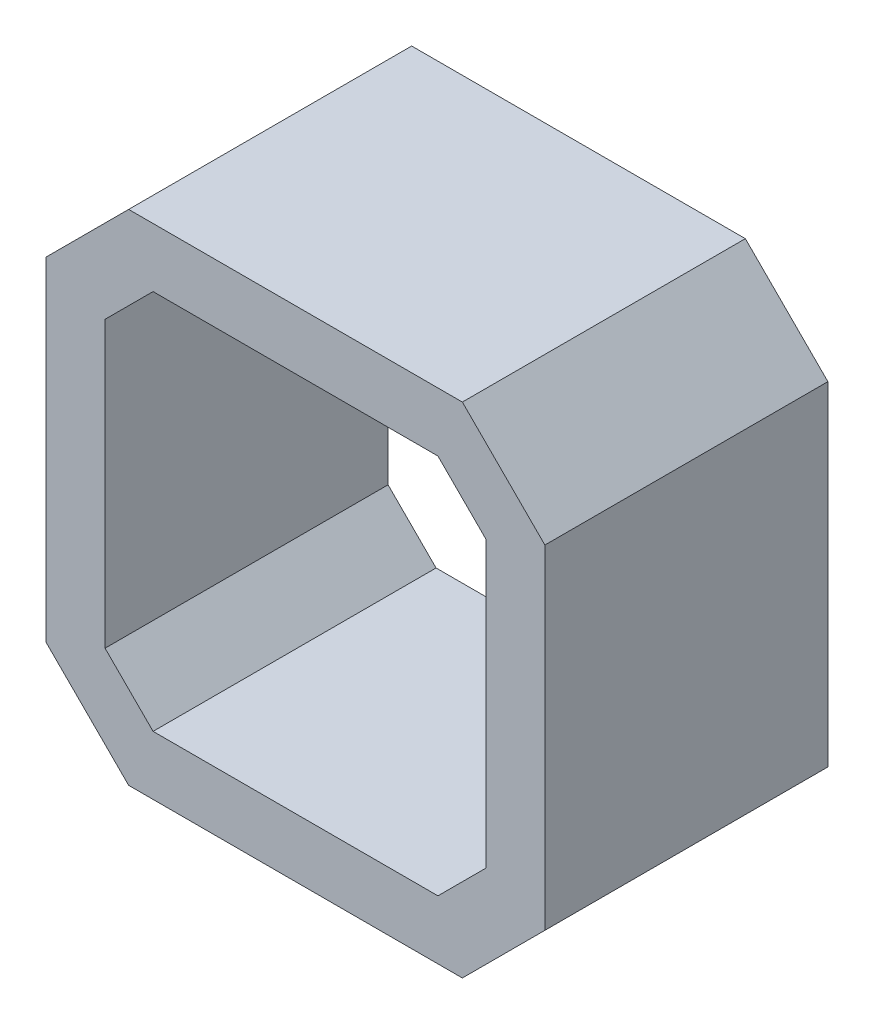
ISO-10303-21;
HEADER;
FILE_DESCRIPTION(('STEP AP214'),'2;1');
FILE_NAME('part.step','',(''),(''),'','','');
FILE_SCHEMA(('AUTOMOTIVE_DESIGN { 1 0 10303 214 1 1 1 1 }'));
ENDSEC;
DATA;
#1=APPLICATION_CONTEXT('core data for automotive mechanical design processes');
#2=APPLICATION_PROTOCOL_DEFINITION('international standard','automotive_design',2000,#1);
#3=PRODUCT_CONTEXT('',#1,'mechanical');
#4=PRODUCT('Part','Part','',(#3));
#5=PRODUCT_RELATED_PRODUCT_CATEGORY('part','',(#4));
#6=PRODUCT_DEFINITION_FORMATION('','',#4);
#7=PRODUCT_DEFINITION_CONTEXT('part definition',#1,'design');
#8=PRODUCT_DEFINITION('design','',#6,#7);
#9=PRODUCT_DEFINITION_SHAPE('','',#8);
#10=(LENGTH_UNIT() NAMED_UNIT(*) SI_UNIT(.MILLI.,.METRE.));
#11=(NAMED_UNIT(*) PLANE_ANGLE_UNIT() SI_UNIT($,.RADIAN.));
#12=(NAMED_UNIT(*) SI_UNIT($,.STERADIAN.) SOLID_ANGLE_UNIT());
#13=UNCERTAINTY_MEASURE_WITH_UNIT(LENGTH_MEASURE(1.E-05),#10,'distance_accuracy_value','');
#14=(GEOMETRIC_REPRESENTATION_CONTEXT(3) GLOBAL_UNCERTAINTY_ASSIGNED_CONTEXT((#13)) GLOBAL_UNIT_ASSIGNED_CONTEXT((#10,
#11,#12)) REPRESENTATION_CONTEXT('',''));
#15=CARTESIAN_POINT('',(0.,0.,0.));
#16=DIRECTION('',(0.,0.,1.));
#17=DIRECTION('',(1.,0.,0.));
#18=AXIS2_PLACEMENT_3D('',#15,#16,#17);
#19=CARTESIAN_POINT('',(0.,0.,24.));
#20=DIRECTION('',(0.,0.,-1.));
#21=DIRECTION('',(-1.,0.,0.));
#22=AXIS2_PLACEMENT_3D('',#19,#20,#21);
#23=PLANE('',#22);
#24=DIRECTION('',(-1.,0.,0.));
#25=VECTOR('',#24,1.);
#26=CARTESIAN_POINT('',(14.15,21.15,24.));
#27=LINE('',#26,#25);
#28=CARTESIAN_POINT('',(14.15,21.15,24.));
#29=VERTEX_POINT('',#28);
#30=CARTESIAN_POINT('',(-14.15,21.15,24.));
#31=VERTEX_POINT('',#30);
#32=EDGE_CURVE('E255',#29,#31,#27,.T.);
#33=ORIENTED_EDGE('',*,*,#32,.T.);
#34=DIRECTION('',(-0.707106781186547,-0.707106781186547,0.));
#35=VECTOR('',#34,1.);
#36=CARTESIAN_POINT('',(-14.15,21.15,24.));
#37=LINE('',#36,#35);
#38=CARTESIAN_POINT('',(-21.15,14.15,24.));
#39=VERTEX_POINT('',#38);
#40=EDGE_CURVE('E259',#31,#39,#37,.T.);
#41=ORIENTED_EDGE('',*,*,#40,.T.);
#42=DIRECTION('',(0.,-1.,0.));
#43=VECTOR('',#42,1.);
#44=CARTESIAN_POINT('',(-21.15,-14.15,24.));
#45=LINE('',#44,#43);
#46=CARTESIAN_POINT('',(-21.15,-14.15,24.));
#47=VERTEX_POINT('',#46);
#48=EDGE_CURVE('E263',#39,#47,#45,.T.);
#49=ORIENTED_EDGE('',*,*,#48,.T.);
#50=DIRECTION('',(0.707106781186547,-0.707106781186547,0.));
#51=VECTOR('',#50,1.);
#52=CARTESIAN_POINT('',(-14.15,-21.15,24.));
#53=LINE('',#52,#51);
#54=CARTESIAN_POINT('',(-14.15,-21.15,24.));
#55=VERTEX_POINT('',#54);
#56=EDGE_CURVE('E266',#47,#55,#53,.T.);
#57=ORIENTED_EDGE('',*,*,#56,.T.);
#58=DIRECTION('',(1.,0.,0.));
#59=VECTOR('',#58,1.);
#60=CARTESIAN_POINT('',(14.15,-21.15,24.));
#61=LINE('',#60,#59);
#62=CARTESIAN_POINT('',(14.15,-21.15,24.));
#63=VERTEX_POINT('',#62);
#64=EDGE_CURVE('E269',#55,#63,#61,.T.);
#65=ORIENTED_EDGE('',*,*,#64,.T.);
#66=DIRECTION('',(0.707106781186547,0.707106781186547,0.));
#67=VECTOR('',#66,1.);
#68=CARTESIAN_POINT('',(21.15,-14.15,24.));
#69=LINE('',#68,#67);
#70=CARTESIAN_POINT('',(21.15,-14.15,24.));
#71=VERTEX_POINT('',#70);
#72=EDGE_CURVE('E272',#63,#71,#69,.T.);
#73=ORIENTED_EDGE('',*,*,#72,.T.);
#74=DIRECTION('',(0.,1.,0.));
#75=VECTOR('',#74,1.);
#76=CARTESIAN_POINT('',(21.15,-14.15,24.));
#77=LINE('',#76,#75);
#78=CARTESIAN_POINT('',(21.15,14.15,24.));
#79=VERTEX_POINT('',#78);
#80=EDGE_CURVE('E275',#71,#79,#77,.T.);
#81=ORIENTED_EDGE('',*,*,#80,.T.);
#82=DIRECTION('',(-0.707106781186547,0.707106781186547,0.));
#83=VECTOR('',#82,1.);
#84=CARTESIAN_POINT('',(21.15,14.15,24.));
#85=LINE('',#84,#83);
#86=EDGE_CURVE('E278',#79,#29,#85,.T.);
#87=ORIENTED_EDGE('',*,*,#86,.T.);
#88=EDGE_LOOP('',(#33,#41,#49,#57,#65,#73,#81,#87));
#89=FACE_BOUND('',#88,.T.);
#90=DIRECTION('',(-0.707106781186547,0.707106781186547,0.));
#91=VECTOR('',#90,1.);
#92=CARTESIAN_POINT('',(16.15,12.0789321881345,24.));
#93=LINE('',#92,#91);
#94=CARTESIAN_POINT('',(16.15,12.0789321881345,24.));
#95=VERTEX_POINT('',#94);
#96=CARTESIAN_POINT('',(12.0789321881345,16.15,24.));
#97=VERTEX_POINT('',#96);
#98=EDGE_CURVE('E164',#95,#97,#93,.T.);
#99=ORIENTED_EDGE('',*,*,#98,.F.);
#100=DIRECTION('',(0.,1.,0.));
#101=VECTOR('',#100,1.);
#102=CARTESIAN_POINT('',(16.15,-12.0789321881345,24.));
#103=LINE('',#102,#101);
#104=CARTESIAN_POINT('',(16.15,-12.0789321881345,24.));
#105=VERTEX_POINT('',#104);
#106=EDGE_CURVE('E208',#105,#95,#103,.T.);
#107=ORIENTED_EDGE('',*,*,#106,.F.);
#108=DIRECTION('',(0.707106781186547,0.707106781186547,0.));
#109=VECTOR('',#108,1.);
#110=CARTESIAN_POINT('',(16.15,-12.0789321881345,24.));
#111=LINE('',#110,#109);
#112=CARTESIAN_POINT('',(12.0789321881345,-16.15,24.));
#113=VERTEX_POINT('',#112);
#114=EDGE_CURVE('E205',#113,#105,#111,.T.);
#115=ORIENTED_EDGE('',*,*,#114,.F.);
#116=DIRECTION('',(1.,0.,0.));
#117=VECTOR('',#116,1.);
#118=CARTESIAN_POINT('',(12.0789321881345,-16.15,24.));
#119=LINE('',#118,#117);
#120=CARTESIAN_POINT('',(-12.0789321881345,-16.15,24.));
#121=VERTEX_POINT('',#120);
#122=EDGE_CURVE('E202',#121,#113,#119,.T.);
#123=ORIENTED_EDGE('',*,*,#122,.F.);
#124=DIRECTION('',(0.707106781186547,-0.707106781186547,0.));
#125=VECTOR('',#124,1.);
#126=CARTESIAN_POINT('',(-12.0789321881345,-16.15,24.));
#127=LINE('',#126,#125);
#128=CARTESIAN_POINT('',(-16.15,-12.0789321881345,24.));
#129=VERTEX_POINT('',#128);
#130=EDGE_CURVE('E199',#129,#121,#127,.T.);
#131=ORIENTED_EDGE('',*,*,#130,.F.);
#132=DIRECTION('',(0.,-1.,0.));
#133=VECTOR('',#132,1.);
#134=CARTESIAN_POINT('',(-16.15,-12.0789321881345,24.));
#135=LINE('',#134,#133);
#136=CARTESIAN_POINT('',(-16.15,12.0789321881345,24.));
#137=VERTEX_POINT('',#136);
#138=EDGE_CURVE('E194',#137,#129,#135,.T.);
#139=ORIENTED_EDGE('',*,*,#138,.F.);
#140=DIRECTION('',(-0.707106781186548,-0.707106781186547,0.));
#141=VECTOR('',#140,1.);
#142=CARTESIAN_POINT('',(-12.0789321881345,16.15,24.));
#143=LINE('',#142,#141);
#144=CARTESIAN_POINT('',(-12.0789321881345,16.15,24.));
#145=VERTEX_POINT('',#144);
#146=EDGE_CURVE('E187',#145,#137,#143,.T.);
#147=ORIENTED_EDGE('',*,*,#146,.F.);
#148=DIRECTION('',(-1.,0.,0.));
#149=VECTOR('',#148,1.);
#150=CARTESIAN_POINT('',(12.0789321881345,16.15,24.));
#151=LINE('',#150,#149);
#152=EDGE_CURVE('E173',#97,#145,#151,.T.);
#153=ORIENTED_EDGE('',*,*,#152,.F.);
#154=EDGE_LOOP('',(#99,#107,#115,#123,#131,#139,#147,#153));
#155=FACE_BOUND('',#154,.T.);
#156=ADVANCED_FACE('F50',(#89,#155),#23,.F.);
#157=CARTESIAN_POINT('',(0.,0.,0.));
#158=DIRECTION('',(0.,0.,-1.));
#159=DIRECTION('',(-1.,0.,0.));
#160=AXIS2_PLACEMENT_3D('',#157,#158,#159);
#161=PLANE('',#160);
#162=DIRECTION('',(-1.,0.,0.));
#163=VECTOR('',#162,1.);
#164=CARTESIAN_POINT('',(14.15,21.15,0.));
#165=LINE('',#164,#163);
#166=CARTESIAN_POINT('',(14.15,21.15,0.));
#167=VERTEX_POINT('',#166);
#168=CARTESIAN_POINT('',(-14.15,21.15,0.));
#169=VERTEX_POINT('',#168);
#170=EDGE_CURVE('E182',#167,#169,#165,.T.);
#171=ORIENTED_EDGE('',*,*,#170,.F.);
#172=DIRECTION('',(-0.707106781186547,0.707106781186547,0.));
#173=VECTOR('',#172,1.);
#174=CARTESIAN_POINT('',(21.15,14.15,0.));
#175=LINE('',#174,#173);
#176=CARTESIAN_POINT('',(21.15,14.15,0.));
#177=VERTEX_POINT('',#176);
#178=EDGE_CURVE('E260',#177,#167,#175,.T.);
#179=ORIENTED_EDGE('',*,*,#178,.F.);
#180=DIRECTION('',(0.,1.,0.));
#181=VECTOR('',#180,1.);
#182=CARTESIAN_POINT('',(21.15,-14.15,0.));
#183=LINE('',#182,#181);
#184=CARTESIAN_POINT('',(21.15,-14.15,0.));
#185=VERTEX_POINT('',#184);
#186=EDGE_CURVE('E300',#185,#177,#183,.T.);
#187=ORIENTED_EDGE('',*,*,#186,.F.);
#188=DIRECTION('',(0.707106781186547,0.707106781186547,0.));
#189=VECTOR('',#188,1.);
#190=CARTESIAN_POINT('',(21.15,-14.15,0.));
#191=LINE('',#190,#189);
#192=CARTESIAN_POINT('',(14.15,-21.15,0.));
#193=VERTEX_POINT('',#192);
#194=EDGE_CURVE('E297',#193,#185,#191,.T.);
#195=ORIENTED_EDGE('',*,*,#194,.F.);
#196=DIRECTION('',(1.,0.,0.));
#197=VECTOR('',#196,1.);
#198=CARTESIAN_POINT('',(14.15,-21.15,0.));
#199=LINE('',#198,#197);
#200=CARTESIAN_POINT('',(-14.15,-21.15,0.));
#201=VERTEX_POINT('',#200);
#202=EDGE_CURVE('E294',#201,#193,#199,.T.);
#203=ORIENTED_EDGE('',*,*,#202,.F.);
#204=DIRECTION('',(0.707106781186547,-0.707106781186547,0.));
#205=VECTOR('',#204,1.);
#206=CARTESIAN_POINT('',(-14.15,-21.15,0.));
#207=LINE('',#206,#205);
#208=CARTESIAN_POINT('',(-21.15,-14.15,0.));
#209=VERTEX_POINT('',#208);
#210=EDGE_CURVE('E291',#209,#201,#207,.T.);
#211=ORIENTED_EDGE('',*,*,#210,.F.);
#212=DIRECTION('',(0.,-1.,0.));
#213=VECTOR('',#212,1.);
#214=CARTESIAN_POINT('',(-21.15,-14.15,0.));
#215=LINE('',#214,#213);
#216=CARTESIAN_POINT('',(-21.15,14.15,0.));
#217=VERTEX_POINT('',#216);
#218=EDGE_CURVE('E288',#217,#209,#215,.T.);
#219=ORIENTED_EDGE('',*,*,#218,.F.);
#220=DIRECTION('',(-0.707106781186547,-0.707106781186547,0.));
#221=VECTOR('',#220,1.);
#222=CARTESIAN_POINT('',(-14.15,21.15,0.));
#223=LINE('',#222,#221);
#224=EDGE_CURVE('E285',#169,#217,#223,.T.);
#225=ORIENTED_EDGE('',*,*,#224,.F.);
#226=EDGE_LOOP('',(#171,#179,#187,#195,#203,#211,#219,#225));
#227=FACE_BOUND('',#226,.T.);
#228=DIRECTION('',(0.,1.,0.));
#229=VECTOR('',#228,1.);
#230=CARTESIAN_POINT('',(16.15,-12.0789321881345,0.));
#231=LINE('',#230,#229);
#232=CARTESIAN_POINT('',(16.15,-12.0789321881345,0.));
#233=VERTEX_POINT('',#232);
#234=CARTESIAN_POINT('',(16.15,12.0789321881345,0.));
#235=VERTEX_POINT('',#234);
#236=EDGE_CURVE('E174',#233,#235,#231,.T.);
#237=ORIENTED_EDGE('',*,*,#236,.T.);
#238=DIRECTION('',(-0.707106781186547,0.707106781186547,0.));
#239=VECTOR('',#238,1.);
#240=CARTESIAN_POINT('',(16.15,12.0789321881345,0.));
#241=LINE('',#240,#239);
#242=CARTESIAN_POINT('',(12.0789321881345,16.15,0.));
#243=VERTEX_POINT('',#242);
#244=EDGE_CURVE('E74',#235,#243,#241,.T.);
#245=ORIENTED_EDGE('',*,*,#244,.T.);
#246=DIRECTION('',(-1.,0.,0.));
#247=VECTOR('',#246,1.);
#248=CARTESIAN_POINT('',(12.0789321881345,16.15,0.));
#249=LINE('',#248,#247);
#250=CARTESIAN_POINT('',(-12.0789321881345,16.15,0.));
#251=VERTEX_POINT('',#250);
#252=EDGE_CURVE('E180',#243,#251,#249,.T.);
#253=ORIENTED_EDGE('',*,*,#252,.T.);
#254=DIRECTION('',(-0.707106781186548,-0.707106781186547,0.));
#255=VECTOR('',#254,1.);
#256=CARTESIAN_POINT('',(-12.0789321881345,16.15,0.));
#257=LINE('',#256,#255);
#258=CARTESIAN_POINT('',(-16.15,12.0789321881345,0.));
#259=VERTEX_POINT('',#258);
#260=EDGE_CURVE('E215',#251,#259,#257,.T.);
#261=ORIENTED_EDGE('',*,*,#260,.T.);
#262=DIRECTION('',(0.,-1.,0.));
#263=VECTOR('',#262,1.);
#264=CARTESIAN_POINT('',(-16.15,-12.0789321881345,0.));
#265=LINE('',#264,#263);
#266=CARTESIAN_POINT('',(-16.15,-12.0789321881345,0.));
#267=VERTEX_POINT('',#266);
#268=EDGE_CURVE('E219',#259,#267,#265,.T.);
#269=ORIENTED_EDGE('',*,*,#268,.T.);
#270=DIRECTION('',(0.707106781186547,-0.707106781186547,0.));
#271=VECTOR('',#270,1.);
#272=CARTESIAN_POINT('',(-12.0789321881345,-16.15,0.));
#273=LINE('',#272,#271);
#274=CARTESIAN_POINT('',(-12.0789321881345,-16.15,0.));
#275=VERTEX_POINT('',#274);
#276=EDGE_CURVE('E223',#267,#275,#273,.T.);
#277=ORIENTED_EDGE('',*,*,#276,.T.);
#278=DIRECTION('',(1.,0.,0.));
#279=VECTOR('',#278,1.);
#280=CARTESIAN_POINT('',(12.0789321881345,-16.15,0.));
#281=LINE('',#280,#279);
#282=CARTESIAN_POINT('',(12.0789321881345,-16.15,0.));
#283=VERTEX_POINT('',#282);
#284=EDGE_CURVE('E227',#275,#283,#281,.T.);
#285=ORIENTED_EDGE('',*,*,#284,.T.);
#286=DIRECTION('',(0.707106781186547,0.707106781186547,0.));
#287=VECTOR('',#286,1.);
#288=CARTESIAN_POINT('',(16.15,-12.0789321881345,0.));
#289=LINE('',#288,#287);
#290=EDGE_CURVE('E231',#283,#233,#289,.T.);
#291=ORIENTED_EDGE('',*,*,#290,.T.);
#292=EDGE_LOOP('',(#237,#245,#253,#261,#269,#277,#285,#291));
#293=FACE_BOUND('',#292,.T.);
#294=ADVANCED_FACE('F339',(#227,#293),#161,.T.);
#295=CARTESIAN_POINT('',(14.15,21.15,24.));
#296=DIRECTION('',(0.,-1.,0.));
#297=DIRECTION('',(1.,0.,0.));
#298=AXIS2_PLACEMENT_3D('',#295,#296,#297);
#299=PLANE('',#298);
#300=ORIENTED_EDGE('',*,*,#170,.T.);
#301=DIRECTION('',(0.,0.,-1.));
#302=VECTOR('',#301,1.);
#303=CARTESIAN_POINT('',(-14.15,21.15,24.));
#304=LINE('',#303,#302);
#305=EDGE_CURVE('E11',#31,#169,#304,.T.);
#306=ORIENTED_EDGE('',*,*,#305,.F.);
#307=ORIENTED_EDGE('',*,*,#32,.F.);
#308=DIRECTION('',(0.,0.,-1.));
#309=VECTOR('',#308,1.);
#310=CARTESIAN_POINT('',(14.15,21.15,24.));
#311=LINE('',#310,#309);
#312=EDGE_CURVE('E281',#29,#167,#311,.T.);
#313=ORIENTED_EDGE('',*,*,#312,.T.);
#314=EDGE_LOOP('',(#300,#306,#307,#313));
#315=FACE_BOUND('',#314,.T.);
#316=ADVANCED_FACE('F52',(#315),#299,.F.);
#317=CARTESIAN_POINT('',(-14.15,21.15,24.));
#318=DIRECTION('',(0.707106781186548,-0.707106781186548,0.));
#319=DIRECTION('',(0.707106781186548,0.707106781186548,0.));
#320=AXIS2_PLACEMENT_3D('',#317,#318,#319);
#321=PLANE('',#320);
#322=ORIENTED_EDGE('',*,*,#224,.T.);
#323=DIRECTION('',(0.,0.,-1.));
#324=VECTOR('',#323,1.);
#325=CARTESIAN_POINT('',(-21.15,14.15,24.));
#326=LINE('',#325,#324);
#327=EDGE_CURVE('E59',#39,#217,#326,.T.);
#328=ORIENTED_EDGE('',*,*,#327,.F.);
#329=ORIENTED_EDGE('',*,*,#40,.F.);
#330=ORIENTED_EDGE('',*,*,#305,.T.);
#331=EDGE_LOOP('',(#322,#328,#329,#330));
#332=FACE_BOUND('',#331,.T.);
#333=ADVANCED_FACE('F356',(#332),#321,.F.);
#334=CARTESIAN_POINT('',(-21.15,-14.15,24.));
#335=DIRECTION('',(1.,0.,0.));
#336=DIRECTION('',(0.,0.,-1.));
#337=AXIS2_PLACEMENT_3D('',#334,#335,#336);
#338=PLANE('',#337);
#339=ORIENTED_EDGE('',*,*,#218,.T.);
#340=DIRECTION('',(0.,0.,-1.));
#341=VECTOR('',#340,1.);
#342=CARTESIAN_POINT('',(-21.15,-14.15,24.));
#343=LINE('',#342,#341);
#344=EDGE_CURVE('E323',#47,#209,#343,.T.);
#345=ORIENTED_EDGE('',*,*,#344,.F.);
#346=ORIENTED_EDGE('',*,*,#48,.F.);
#347=ORIENTED_EDGE('',*,*,#327,.T.);
#348=EDGE_LOOP('',(#339,#345,#346,#347));
#349=FACE_BOUND('',#348,.T.);
#350=ADVANCED_FACE('F333',(#349),#338,.F.);
#351=CARTESIAN_POINT('',(-14.15,-21.15,24.));
#352=DIRECTION('',(0.707106781186548,0.707106781186548,0.));
#353=DIRECTION('',(-0.707106781186548,0.707106781186548,0.));
#354=AXIS2_PLACEMENT_3D('',#351,#352,#353);
#355=PLANE('',#354);
#356=ORIENTED_EDGE('',*,*,#210,.T.);
#357=DIRECTION('',(0.,0.,-1.));
#358=VECTOR('',#357,1.);
#359=CARTESIAN_POINT('',(-14.15,-21.15,24.));
#360=LINE('',#359,#358);
#361=EDGE_CURVE('E319',#55,#201,#360,.T.);
#362=ORIENTED_EDGE('',*,*,#361,.F.);
#363=ORIENTED_EDGE('',*,*,#56,.F.);
#364=ORIENTED_EDGE('',*,*,#344,.T.);
#365=EDGE_LOOP('',(#356,#362,#363,#364));
#366=FACE_BOUND('',#365,.T.);
#367=ADVANCED_FACE('F345',(#366),#355,.F.);
#368=CARTESIAN_POINT('',(14.15,-21.15,24.));
#369=DIRECTION('',(0.,1.,0.));
#370=DIRECTION('',(-1.,0.,0.));
#371=AXIS2_PLACEMENT_3D('',#368,#369,#370);
#372=PLANE('',#371);
#373=ORIENTED_EDGE('',*,*,#202,.T.);
#374=DIRECTION('',(0.,0.,-1.));
#375=VECTOR('',#374,1.);
#376=CARTESIAN_POINT('',(14.15,-21.15,24.));
#377=LINE('',#376,#375);
#378=EDGE_CURVE('E315',#63,#193,#377,.T.);
#379=ORIENTED_EDGE('',*,*,#378,.F.);
#380=ORIENTED_EDGE('',*,*,#64,.F.);
#381=ORIENTED_EDGE('',*,*,#361,.T.);
#382=EDGE_LOOP('',(#373,#379,#380,#381));
#383=FACE_BOUND('',#382,.T.);
#384=ADVANCED_FACE('F349',(#383),#372,.F.);
#385=CARTESIAN_POINT('',(21.15,-14.15,24.));
#386=DIRECTION('',(-0.707106781186548,0.707106781186548,0.));
#387=DIRECTION('',(-0.707106781186548,-0.707106781186548,0.));
#388=AXIS2_PLACEMENT_3D('',#385,#386,#387);
#389=PLANE('',#388);
#390=ORIENTED_EDGE('',*,*,#194,.T.);
#391=DIRECTION('',(0.,0.,-1.));
#392=VECTOR('',#391,1.);
#393=CARTESIAN_POINT('',(21.15,-14.15,24.));
#394=LINE('',#393,#392);
#395=EDGE_CURVE('E311',#71,#185,#394,.T.);
#396=ORIENTED_EDGE('',*,*,#395,.F.);
#397=ORIENTED_EDGE('',*,*,#72,.F.);
#398=ORIENTED_EDGE('',*,*,#378,.T.);
#399=EDGE_LOOP('',(#390,#396,#397,#398));
#400=FACE_BOUND('',#399,.T.);
#401=ADVANCED_FACE('F369',(#400),#389,.F.);
#402=CARTESIAN_POINT('',(21.15,-14.15,24.));
#403=DIRECTION('',(-1.,0.,0.));
#404=DIRECTION('',(0.,-1.,0.));
#405=AXIS2_PLACEMENT_3D('',#402,#403,#404);
#406=PLANE('',#405);
#407=ORIENTED_EDGE('',*,*,#186,.T.);
#408=DIRECTION('',(0.,0.,-1.));
#409=VECTOR('',#408,1.);
#410=CARTESIAN_POINT('',(21.15,14.15,24.));
#411=LINE('',#410,#409);
#412=EDGE_CURVE('E308',#79,#177,#411,.T.);
#413=ORIENTED_EDGE('',*,*,#412,.F.);
#414=ORIENTED_EDGE('',*,*,#80,.F.);
#415=ORIENTED_EDGE('',*,*,#395,.T.);
#416=EDGE_LOOP('',(#407,#413,#414,#415));
#417=FACE_BOUND('',#416,.T.);
#418=ADVANCED_FACE('F367',(#417),#406,.F.);
#419=CARTESIAN_POINT('',(21.15,14.15,24.));
#420=DIRECTION('',(-0.707106781186548,-0.707106781186548,0.));
#421=DIRECTION('',(0.707106781186548,-0.707106781186548,0.));
#422=AXIS2_PLACEMENT_3D('',#419,#420,#421);
#423=PLANE('',#422);
#424=ORIENTED_EDGE('',*,*,#178,.T.);
#425=ORIENTED_EDGE('',*,*,#312,.F.);
#426=ORIENTED_EDGE('',*,*,#86,.F.);
#427=ORIENTED_EDGE('',*,*,#412,.T.);
#428=EDGE_LOOP('',(#424,#425,#426,#427));
#429=FACE_BOUND('',#428,.T.);
#430=ADVANCED_FACE('F362',(#429),#423,.F.);
#431=CARTESIAN_POINT('',(16.15,12.0789321881345,24.));
#432=DIRECTION('',(-0.707106781186548,-0.707106781186548,0.));
#433=DIRECTION('',(0.707106781186548,-0.707106781186548,0.));
#434=AXIS2_PLACEMENT_3D('',#431,#432,#433);
#435=PLANE('',#434);
#436=ORIENTED_EDGE('',*,*,#244,.F.);
#437=DIRECTION('',(0.,0.,-1.));
#438=VECTOR('',#437,1.);
#439=CARTESIAN_POINT('',(16.15,12.0789321881345,24.));
#440=LINE('',#439,#438);
#441=EDGE_CURVE('E168',#95,#235,#440,.T.);
#442=ORIENTED_EDGE('',*,*,#441,.F.);
#443=ORIENTED_EDGE('',*,*,#98,.T.);
#444=DIRECTION('',(0.,0.,-1.));
#445=VECTOR('',#444,1.);
#446=CARTESIAN_POINT('',(12.0789321881345,16.15,24.));
#447=LINE('',#446,#445);
#448=EDGE_CURVE('E167',#97,#243,#447,.T.);
#449=ORIENTED_EDGE('',*,*,#448,.T.);
#450=EDGE_LOOP('',(#436,#442,#443,#449));
#451=FACE_BOUND('',#450,.T.);
#452=ADVANCED_FACE('F166',(#451),#435,.T.);
#453=CARTESIAN_POINT('',(12.0789321881345,16.15,24.));
#454=DIRECTION('',(0.,-1.,0.));
#455=DIRECTION('',(0.,0.,-1.));
#456=AXIS2_PLACEMENT_3D('',#453,#454,#455);
#457=PLANE('',#456);
#458=ORIENTED_EDGE('',*,*,#252,.F.);
#459=ORIENTED_EDGE('',*,*,#448,.F.);
#460=ORIENTED_EDGE('',*,*,#152,.T.);
#461=DIRECTION('',(0.,0.,-1.));
#462=VECTOR('',#461,1.);
#463=CARTESIAN_POINT('',(-12.0789321881345,16.15,24.));
#464=LINE('',#463,#462);
#465=EDGE_CURVE('E183',#145,#251,#464,.T.);
#466=ORIENTED_EDGE('',*,*,#465,.T.);
#467=EDGE_LOOP('',(#458,#459,#460,#466));
#468=FACE_BOUND('',#467,.T.);
#469=ADVANCED_FACE('F177',(#468),#457,.T.);
#470=CARTESIAN_POINT('',(-12.0789321881345,16.15,24.));
#471=DIRECTION('',(0.707106781186547,-0.707106781186548,0.));
#472=DIRECTION('',(0.707106781186548,0.707106781186547,0.));
#473=AXIS2_PLACEMENT_3D('',#470,#471,#472);
#474=PLANE('',#473);
#475=ORIENTED_EDGE('',*,*,#260,.F.);
#476=ORIENTED_EDGE('',*,*,#465,.F.);
#477=ORIENTED_EDGE('',*,*,#146,.T.);
#478=DIRECTION('',(0.,0.,-1.));
#479=VECTOR('',#478,1.);
#480=CARTESIAN_POINT('',(-16.15,12.0789321881345,24.));
#481=LINE('',#480,#479);
#482=EDGE_CURVE('E250',#137,#259,#481,.T.);
#483=ORIENTED_EDGE('',*,*,#482,.T.);
#484=EDGE_LOOP('',(#475,#476,#477,#483));
#485=FACE_BOUND('',#484,.T.);
#486=ADVANCED_FACE('F394',(#485),#474,.T.);
#487=CARTESIAN_POINT('',(-16.15,-12.0789321881345,24.));
#488=DIRECTION('',(1.,0.,0.));
#489=DIRECTION('',(0.,0.,-1.));
#490=AXIS2_PLACEMENT_3D('',#487,#488,#489);
#491=PLANE('',#490);
#492=ORIENTED_EDGE('',*,*,#268,.F.);
#493=ORIENTED_EDGE('',*,*,#482,.F.);
#494=ORIENTED_EDGE('',*,*,#138,.T.);
#495=DIRECTION('',(0.,0.,-1.));
#496=VECTOR('',#495,1.);
#497=CARTESIAN_POINT('',(-16.15,-12.0789321881345,24.));
#498=LINE('',#497,#496);
#499=EDGE_CURVE('E247',#129,#267,#498,.T.);
#500=ORIENTED_EDGE('',*,*,#499,.T.);
#501=EDGE_LOOP('',(#492,#493,#494,#500));
#502=FACE_BOUND('',#501,.T.);
#503=ADVANCED_FACE('F398',(#502),#491,.T.);
#504=CARTESIAN_POINT('',(-12.0789321881345,-16.15,24.));
#505=DIRECTION('',(0.707106781186548,0.707106781186548,0.));
#506=DIRECTION('',(-0.707106781186548,0.707106781186548,0.));
#507=AXIS2_PLACEMENT_3D('',#504,#505,#506);
#508=PLANE('',#507);
#509=ORIENTED_EDGE('',*,*,#276,.F.);
#510=ORIENTED_EDGE('',*,*,#499,.F.);
#511=ORIENTED_EDGE('',*,*,#130,.T.);
#512=DIRECTION('',(0.,0.,-1.));
#513=VECTOR('',#512,1.);
#514=CARTESIAN_POINT('',(-12.0789321881345,-16.15,24.));
#515=LINE('',#514,#513);
#516=EDGE_CURVE('E245',#121,#275,#515,.T.);
#517=ORIENTED_EDGE('',*,*,#516,.T.);
#518=EDGE_LOOP('',(#509,#510,#511,#517));
#519=FACE_BOUND('',#518,.T.);
#520=ADVANCED_FACE('F404',(#519),#508,.T.);
#521=CARTESIAN_POINT('',(12.0789321881345,-16.15,24.));
#522=DIRECTION('',(0.,1.,0.));
#523=DIRECTION('',(0.,0.,1.));
#524=AXIS2_PLACEMENT_3D('',#521,#522,#523);
#525=PLANE('',#524);
#526=ORIENTED_EDGE('',*,*,#284,.F.);
#527=ORIENTED_EDGE('',*,*,#516,.F.);
#528=ORIENTED_EDGE('',*,*,#122,.T.);
#529=DIRECTION('',(0.,0.,-1.));
#530=VECTOR('',#529,1.);
#531=CARTESIAN_POINT('',(12.0789321881345,-16.15,24.));
#532=LINE('',#531,#530);
#533=EDGE_CURVE('E242',#113,#283,#532,.T.);
#534=ORIENTED_EDGE('',*,*,#533,.T.);
#535=EDGE_LOOP('',(#526,#527,#528,#534));
#536=FACE_BOUND('',#535,.T.);
#537=ADVANCED_FACE('F408',(#536),#525,.T.);
#538=CARTESIAN_POINT('',(16.15,-12.0789321881345,24.));
#539=DIRECTION('',(-0.707106781186548,0.707106781186548,0.));
#540=DIRECTION('',(-0.707106781186548,-0.707106781186548,0.));
#541=AXIS2_PLACEMENT_3D('',#538,#539,#540);
#542=PLANE('',#541);
#543=ORIENTED_EDGE('',*,*,#290,.F.);
#544=ORIENTED_EDGE('',*,*,#533,.F.);
#545=ORIENTED_EDGE('',*,*,#114,.T.);
#546=DIRECTION('',(0.,0.,-1.));
#547=VECTOR('',#546,1.);
#548=CARTESIAN_POINT('',(16.15,-12.0789321881345,24.));
#549=LINE('',#548,#547);
#550=EDGE_CURVE('E66',#105,#233,#549,.T.);
#551=ORIENTED_EDGE('',*,*,#550,.T.);
#552=EDGE_LOOP('',(#543,#544,#545,#551));
#553=FACE_BOUND('',#552,.T.);
#554=ADVANCED_FACE('F412',(#553),#542,.T.);
#555=CARTESIAN_POINT('',(16.15,-12.0789321881345,24.));
#556=DIRECTION('',(-1.,0.,0.));
#557=DIRECTION('',(0.,0.,1.));
#558=AXIS2_PLACEMENT_3D('',#555,#556,#557);
#559=PLANE('',#558);
#560=ORIENTED_EDGE('',*,*,#236,.F.);
#561=ORIENTED_EDGE('',*,*,#550,.F.);
#562=ORIENTED_EDGE('',*,*,#106,.T.);
#563=ORIENTED_EDGE('',*,*,#441,.T.);
#564=EDGE_LOOP('',(#560,#561,#562,#563));
#565=FACE_BOUND('',#564,.T.);
#566=ADVANCED_FACE('F416',(#565),#559,.T.);
#567=CLOSED_SHELL('',(#156,#294,#316,#333,#350,#367,#384,#401,#418,#430,#452,#469,#486,#503,
#520,#537,#554,#566));
#568=MANIFOLD_SOLID_BREP('B2',#567);
#569=ADVANCED_BREP_SHAPE_REPRESENTATION('',(#18,#568),#14);
#570=SHAPE_DEFINITION_REPRESENTATION(#9,#569);
ENDSEC;
END-ISO-10303-21;
